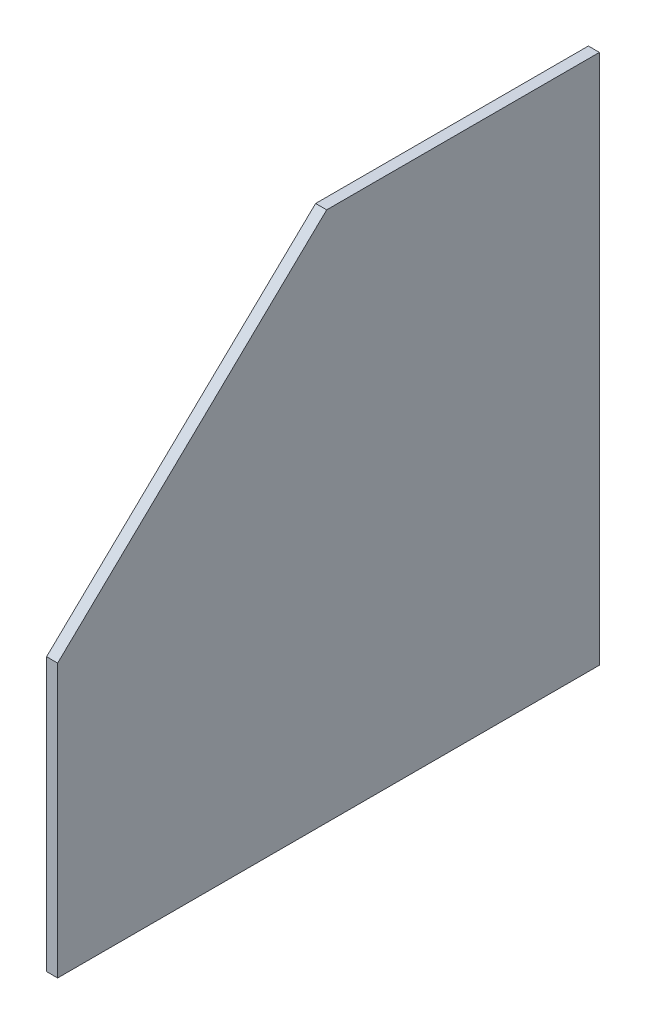
ISO-10303-21;
HEADER;
FILE_DESCRIPTION(('STEP AP214'),'2;1');
FILE_NAME('part.step','',(''),(''),'','','');
FILE_SCHEMA(('AUTOMOTIVE_DESIGN { 1 0 10303 214 1 1 1 1 }'));
ENDSEC;
DATA;
#1=APPLICATION_CONTEXT('core data for automotive mechanical design processes');
#2=APPLICATION_PROTOCOL_DEFINITION('international standard','automotive_design',2000,#1);
#3=PRODUCT_CONTEXT('',#1,'mechanical');
#4=PRODUCT('Part','Part','',(#3));
#5=PRODUCT_RELATED_PRODUCT_CATEGORY('part','',(#4));
#6=PRODUCT_DEFINITION_FORMATION('','',#4);
#7=PRODUCT_DEFINITION_CONTEXT('part definition',#1,'design');
#8=PRODUCT_DEFINITION('design','',#6,#7);
#9=PRODUCT_DEFINITION_SHAPE('','',#8);
#10=(LENGTH_UNIT() NAMED_UNIT(*) SI_UNIT(.MILLI.,.METRE.));
#11=(NAMED_UNIT(*) PLANE_ANGLE_UNIT() SI_UNIT($,.RADIAN.));
#12=(NAMED_UNIT(*) SI_UNIT($,.STERADIAN.) SOLID_ANGLE_UNIT());
#13=UNCERTAINTY_MEASURE_WITH_UNIT(LENGTH_MEASURE(1.E-05),#10,'distance_accuracy_value','');
#14=(GEOMETRIC_REPRESENTATION_CONTEXT(3) GLOBAL_UNCERTAINTY_ASSIGNED_CONTEXT((#13)) GLOBAL_UNIT_ASSIGNED_CONTEXT((#10,
#11,#12)) REPRESENTATION_CONTEXT('',''));
#15=CARTESIAN_POINT('',(0.,0.,0.));
#16=DIRECTION('',(0.,0.,1.));
#17=DIRECTION('',(1.,0.,0.));
#18=AXIS2_PLACEMENT_3D('',#15,#16,#17);
#19=CARTESIAN_POINT('',(-19.05,469.9,0.));
#20=DIRECTION('',(0.,0.,-1.));
#21=DIRECTION('',(0.,1.,0.));
#22=AXIS2_PLACEMENT_3D('',#19,#20,#21);
#23=PLANE('',#22);
#24=DIRECTION('',(0.,1.,0.));
#25=VECTOR('',#24,1.);
#26=CARTESIAN_POINT('',(0.,469.9,0.));
#27=LINE('',#26,#25);
#28=CARTESIAN_POINT('',(0.,0.,0.));
#29=VERTEX_POINT('',#28);
#30=CARTESIAN_POINT('',(0.,469.9,0.));
#31=VERTEX_POINT('',#30);
#32=EDGE_CURVE('E107',#29,#31,#27,.T.);
#33=ORIENTED_EDGE('',*,*,#32,.T.);
#34=DIRECTION('',(1.,0.,0.));
#35=VECTOR('',#34,1.);
#36=CARTESIAN_POINT('',(-19.05,469.9,0.));
#37=LINE('',#36,#35);
#38=CARTESIAN_POINT('',(-19.05,469.9,0.));
#39=VERTEX_POINT('',#38);
#40=EDGE_CURVE('E11',#39,#31,#37,.T.);
#41=ORIENTED_EDGE('',*,*,#40,.F.);
#42=DIRECTION('',(0.,1.,0.));
#43=VECTOR('',#42,1.);
#44=CARTESIAN_POINT('',(-19.05,469.9,0.));
#45=LINE('',#44,#43);
#46=CARTESIAN_POINT('',(-19.05,0.,0.));
#47=VERTEX_POINT('',#46);
#48=EDGE_CURVE('E115',#47,#39,#45,.T.);
#49=ORIENTED_EDGE('',*,*,#48,.F.);
#50=DIRECTION('',(1.,0.,0.));
#51=VECTOR('',#50,1.);
#52=CARTESIAN_POINT('',(-19.05,0.,0.));
#53=LINE('',#52,#51);
#54=EDGE_CURVE('E103',#47,#29,#53,.T.);
#55=ORIENTED_EDGE('',*,*,#54,.T.);
#56=EDGE_LOOP('',(#33,#41,#49,#55));
#57=FACE_BOUND('',#56,.T.);
#58=ADVANCED_FACE('F33',(#57),#23,.F.);
#59=CARTESIAN_POINT('',(-19.05,914.4,-463.55));
#60=DIRECTION('',(0.,-0.721782371472524,-0.692120082233928));
#61=DIRECTION('',(0.,0.692120082233928,-0.721782371472525));
#62=AXIS2_PLACEMENT_3D('',#59,#60,#61);
#63=PLANE('',#62);
#64=DIRECTION('',(0.,0.692120082233928,-0.721782371472525));
#65=VECTOR('',#64,1.);
#66=CARTESIAN_POINT('',(0.,914.4,-463.55));
#67=LINE('',#66,#65);
#68=CARTESIAN_POINT('',(0.,914.4,-463.55));
#69=VERTEX_POINT('',#68);
#70=EDGE_CURVE('E110',#31,#69,#67,.T.);
#71=ORIENTED_EDGE('',*,*,#70,.T.);
#72=DIRECTION('',(1.,0.,0.));
#73=VECTOR('',#72,1.);
#74=CARTESIAN_POINT('',(-19.05,914.4,-463.55));
#75=LINE('',#74,#73);
#76=CARTESIAN_POINT('',(-19.05,914.4,-463.55));
#77=VERTEX_POINT('',#76);
#78=EDGE_CURVE('E41',#77,#69,#75,.T.);
#79=ORIENTED_EDGE('',*,*,#78,.F.);
#80=DIRECTION('',(0.,0.692120082233928,-0.721782371472525));
#81=VECTOR('',#80,1.);
#82=CARTESIAN_POINT('',(-19.05,914.4,-463.55));
#83=LINE('',#82,#81);
#84=EDGE_CURVE('E83',#39,#77,#83,.T.);
#85=ORIENTED_EDGE('',*,*,#84,.F.);
#86=ORIENTED_EDGE('',*,*,#40,.T.);
#87=EDGE_LOOP('',(#71,#79,#85,#86));
#88=FACE_BOUND('',#87,.T.);
#89=ADVANCED_FACE('F134',(#88),#63,.F.);
#90=CARTESIAN_POINT('',(-19.05,914.4,-933.45));
#91=DIRECTION('',(0.,-1.,0.));
#92=DIRECTION('',(0.,0.,-1.));
#93=AXIS2_PLACEMENT_3D('',#90,#91,#92);
#94=PLANE('',#93);
#95=DIRECTION('',(0.,0.,-1.));
#96=VECTOR('',#95,1.);
#97=CARTESIAN_POINT('',(0.,914.4,-933.45));
#98=LINE('',#97,#96);
#99=CARTESIAN_POINT('',(0.,914.4,-933.45));
#100=VERTEX_POINT('',#99);
#101=EDGE_CURVE('E98',#69,#100,#98,.T.);
#102=ORIENTED_EDGE('',*,*,#101,.T.);
#103=DIRECTION('',(1.,0.,0.));
#104=VECTOR('',#103,1.);
#105=CARTESIAN_POINT('',(-19.05,914.4,-933.45));
#106=LINE('',#105,#104);
#107=CARTESIAN_POINT('',(-19.05,914.4,-933.45));
#108=VERTEX_POINT('',#107);
#109=EDGE_CURVE('E95',#108,#100,#106,.T.);
#110=ORIENTED_EDGE('',*,*,#109,.F.);
#111=DIRECTION('',(0.,0.,-1.));
#112=VECTOR('',#111,1.);
#113=CARTESIAN_POINT('',(-19.05,914.4,-933.45));
#114=LINE('',#113,#112);
#115=EDGE_CURVE('E87',#77,#108,#114,.T.);
#116=ORIENTED_EDGE('',*,*,#115,.F.);
#117=ORIENTED_EDGE('',*,*,#78,.T.);
#118=EDGE_LOOP('',(#102,#110,#116,#117));
#119=FACE_BOUND('',#118,.T.);
#120=ADVANCED_FACE('F96',(#119),#94,.F.);
#121=CARTESIAN_POINT('',(-19.05,0.,-933.45));
#122=DIRECTION('',(0.,0.,1.));
#123=DIRECTION('',(1.,0.,0.));
#124=AXIS2_PLACEMENT_3D('',#121,#122,#123);
#125=PLANE('',#124);
#126=DIRECTION('',(0.,-1.,0.));
#127=VECTOR('',#126,1.);
#128=CARTESIAN_POINT('',(0.,0.,-933.45));
#129=LINE('',#128,#127);
#130=CARTESIAN_POINT('',(0.,0.,-933.45));
#131=VERTEX_POINT('',#130);
#132=EDGE_CURVE('E69',#100,#131,#129,.T.);
#133=ORIENTED_EDGE('',*,*,#132,.T.);
#134=DIRECTION('',(1.,0.,0.));
#135=VECTOR('',#134,1.);
#136=CARTESIAN_POINT('',(-19.05,0.,-933.45));
#137=LINE('',#136,#135);
#138=CARTESIAN_POINT('',(-19.05,0.,-933.45));
#139=VERTEX_POINT('',#138);
#140=EDGE_CURVE('E99',#139,#131,#137,.T.);
#141=ORIENTED_EDGE('',*,*,#140,.F.);
#142=DIRECTION('',(0.,-1.,0.));
#143=VECTOR('',#142,1.);
#144=CARTESIAN_POINT('',(-19.05,0.,-933.45));
#145=LINE('',#144,#143);
#146=EDGE_CURVE('E91',#108,#139,#145,.T.);
#147=ORIENTED_EDGE('',*,*,#146,.F.);
#148=ORIENTED_EDGE('',*,*,#109,.T.);
#149=EDGE_LOOP('',(#133,#141,#147,#148));
#150=FACE_BOUND('',#149,.T.);
#151=ADVANCED_FACE('F101',(#150),#125,.F.);
#152=CARTESIAN_POINT('',(-19.05,0.,0.));
#153=DIRECTION('',(0.,1.,0.));
#154=DIRECTION('',(0.,0.,1.));
#155=AXIS2_PLACEMENT_3D('',#152,#153,#154);
#156=PLANE('',#155);
#157=DIRECTION('',(0.,0.,1.));
#158=VECTOR('',#157,1.);
#159=CARTESIAN_POINT('',(0.,0.,0.));
#160=LINE('',#159,#158);
#161=EDGE_CURVE('E75',#131,#29,#160,.T.);
#162=ORIENTED_EDGE('',*,*,#161,.T.);
#163=ORIENTED_EDGE('',*,*,#54,.F.);
#164=DIRECTION('',(0.,0.,1.));
#165=VECTOR('',#164,1.);
#166=CARTESIAN_POINT('',(-19.05,0.,0.));
#167=LINE('',#166,#165);
#168=EDGE_CURVE('E49',#139,#47,#167,.T.);
#169=ORIENTED_EDGE('',*,*,#168,.F.);
#170=ORIENTED_EDGE('',*,*,#140,.T.);
#171=EDGE_LOOP('',(#162,#163,#169,#170));
#172=FACE_BOUND('',#171,.T.);
#173=ADVANCED_FACE('F123',(#172),#156,.F.);
#174=CARTESIAN_POINT('',(-19.05,0.,0.));
#175=DIRECTION('',(1.,0.,0.));
#176=DIRECTION('',(0.,0.,-1.));
#177=AXIS2_PLACEMENT_3D('',#174,#175,#176);
#178=PLANE('',#177);
#179=ORIENTED_EDGE('',*,*,#48,.T.);
#180=ORIENTED_EDGE('',*,*,#84,.T.);
#181=ORIENTED_EDGE('',*,*,#115,.T.);
#182=ORIENTED_EDGE('',*,*,#146,.T.);
#183=ORIENTED_EDGE('',*,*,#168,.T.);
#184=EDGE_LOOP('',(#179,#180,#181,#182,#183));
#185=FACE_BOUND('',#184,.T.);
#186=ADVANCED_FACE('F89',(#185),#178,.F.);
#187=CARTESIAN_POINT('',(0.,0.,0.));
#188=DIRECTION('',(1.,0.,0.));
#189=DIRECTION('',(0.,0.,-1.));
#190=AXIS2_PLACEMENT_3D('',#187,#188,#189);
#191=PLANE('',#190);
#192=ORIENTED_EDGE('',*,*,#32,.F.);
#193=ORIENTED_EDGE('',*,*,#161,.F.);
#194=ORIENTED_EDGE('',*,*,#132,.F.);
#195=ORIENTED_EDGE('',*,*,#101,.F.);
#196=ORIENTED_EDGE('',*,*,#70,.F.);
#197=EDGE_LOOP('',(#192,#193,#194,#195,#196));
#198=FACE_BOUND('',#197,.T.);
#199=ADVANCED_FACE('F119',(#198),#191,.T.);
#200=CLOSED_SHELL('',(#58,#89,#120,#151,#173,#186,#199));
#201=MANIFOLD_SOLID_BREP('B2',#200);
#202=ADVANCED_BREP_SHAPE_REPRESENTATION('',(#18,#201),#14);
#203=SHAPE_DEFINITION_REPRESENTATION(#9,#202);
ENDSEC;
END-ISO-10303-21;
